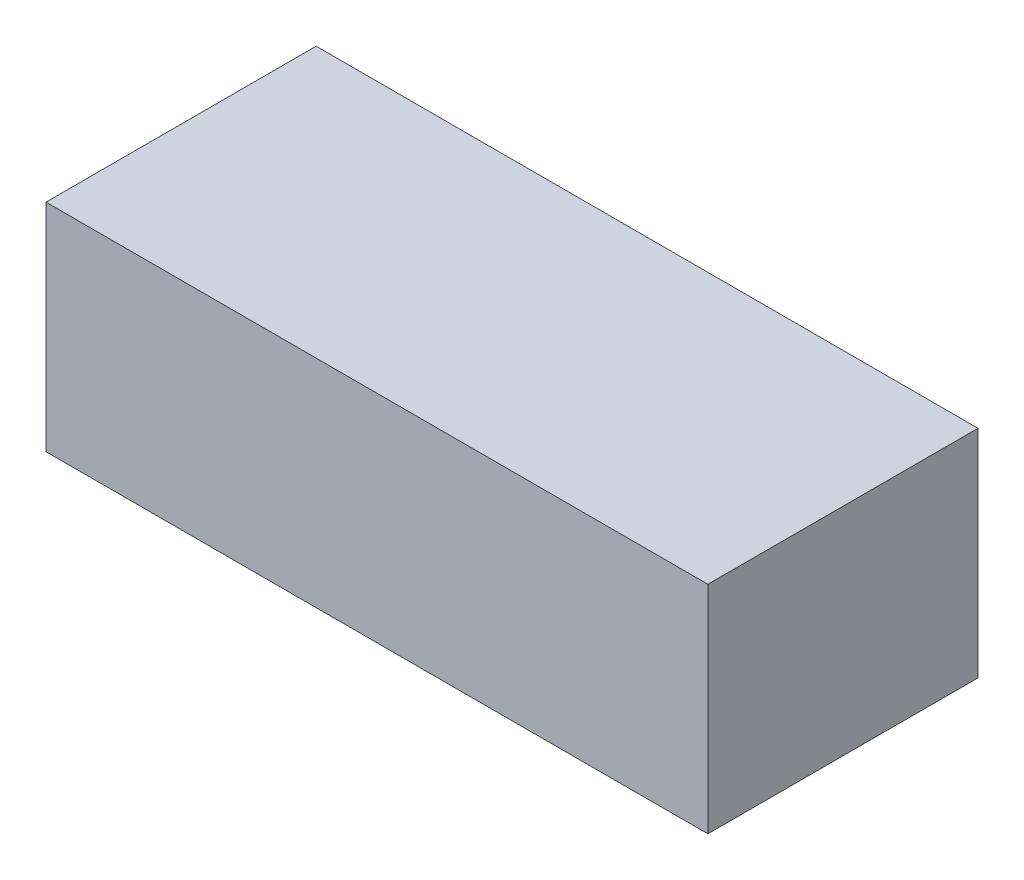
ISO-10303-21;
HEADER;
FILE_DESCRIPTION(('STEP AP214'),'2;1');
FILE_NAME('part.step','',(''),(''),'','','');
FILE_SCHEMA(('AUTOMOTIVE_DESIGN { 1 0 10303 214 1 1 1 1 }'));
ENDSEC;
DATA;
#1=APPLICATION_CONTEXT('core data for automotive mechanical design processes');
#2=APPLICATION_PROTOCOL_DEFINITION('international standard','automotive_design',2000,#1);
#3=PRODUCT_CONTEXT('',#1,'mechanical');
#4=PRODUCT('Part','Part','',(#3));
#5=PRODUCT_RELATED_PRODUCT_CATEGORY('part','',(#4));
#6=PRODUCT_DEFINITION_FORMATION('','',#4);
#7=PRODUCT_DEFINITION_CONTEXT('part definition',#1,'design');
#8=PRODUCT_DEFINITION('design','',#6,#7);
#9=PRODUCT_DEFINITION_SHAPE('','',#8);
#10=(LENGTH_UNIT() NAMED_UNIT(*) SI_UNIT(.MILLI.,.METRE.));
#11=(NAMED_UNIT(*) PLANE_ANGLE_UNIT() SI_UNIT($,.RADIAN.));
#12=(NAMED_UNIT(*) SI_UNIT($,.STERADIAN.) SOLID_ANGLE_UNIT());
#13=UNCERTAINTY_MEASURE_WITH_UNIT(LENGTH_MEASURE(1.E-05),#10,'distance_accuracy_value','');
#14=(GEOMETRIC_REPRESENTATION_CONTEXT(3) GLOBAL_UNCERTAINTY_ASSIGNED_CONTEXT((#13)) GLOBAL_UNIT_ASSIGNED_CONTEXT((#10,
#11,#12)) REPRESENTATION_CONTEXT('',''));
#15=CARTESIAN_POINT('',(0.,0.,0.));
#16=DIRECTION('',(0.,0.,1.));
#17=DIRECTION('',(1.,0.,0.));
#18=AXIS2_PLACEMENT_3D('',#15,#16,#17);
#19=CARTESIAN_POINT('',(-7.61501146984279,16.1266350487382,5.));
#20=DIRECTION('',(1.,0.,0.));
#21=DIRECTION('',(0.,1.,0.));
#22=AXIS2_PLACEMENT_3D('',#19,#20,#21);
#23=PLANE('',#22);
#24=DIRECTION('',(0.,-1.,0.));
#25=VECTOR('',#24,1.);
#26=CARTESIAN_POINT('',(-7.61501146984279,16.1266350487382,0.));
#27=LINE('',#26,#25);
#28=CARTESIAN_POINT('',(-7.61501146984279,16.1266350487382,0.));
#29=VERTEX_POINT('',#28);
#30=CARTESIAN_POINT('',(-7.61501146984279,12.1266350487382,0.));
#31=VERTEX_POINT('',#30);
#32=EDGE_CURVE('E95',#29,#31,#27,.T.);
#33=ORIENTED_EDGE('',*,*,#32,.T.);
#34=DIRECTION('',(0.,0.,-1.));
#35=VECTOR('',#34,1.);
#36=CARTESIAN_POINT('',(-7.61501146984279,12.1266350487382,5.));
#37=LINE('',#36,#35);
#38=CARTESIAN_POINT('',(-7.61501146984279,12.1266350487382,5.));
#39=VERTEX_POINT('',#38);
#40=EDGE_CURVE('E11',#39,#31,#37,.T.);
#41=ORIENTED_EDGE('',*,*,#40,.F.);
#42=DIRECTION('',(0.,-1.,0.));
#43=VECTOR('',#42,1.);
#44=CARTESIAN_POINT('',(-7.61501146984279,16.1266350487382,5.));
#45=LINE('',#44,#43);
#46=CARTESIAN_POINT('',(-7.61501146984279,16.1266350487382,5.));
#47=VERTEX_POINT('',#46);
#48=EDGE_CURVE('E83',#47,#39,#45,.T.);
#49=ORIENTED_EDGE('',*,*,#48,.F.);
#50=DIRECTION('',(0.,0.,-1.));
#51=VECTOR('',#50,1.);
#52=CARTESIAN_POINT('',(-7.61501146984279,16.1266350487382,5.));
#53=LINE('',#52,#51);
#54=EDGE_CURVE('E91',#47,#29,#53,.T.);
#55=ORIENTED_EDGE('',*,*,#54,.T.);
#56=EDGE_LOOP('',(#33,#41,#49,#55));
#57=FACE_BOUND('',#56,.T.);
#58=ADVANCED_FACE('F32',(#57),#23,.F.);
#59=CARTESIAN_POINT('',(-7.61501146984279,12.1266350487382,5.));
#60=DIRECTION('',(0.,1.,0.));
#61=DIRECTION('',(0.,0.,1.));
#62=AXIS2_PLACEMENT_3D('',#59,#60,#61);
#63=PLANE('',#62);
#64=DIRECTION('',(1.,0.,0.));
#65=VECTOR('',#64,1.);
#66=CARTESIAN_POINT('',(-7.61501146984279,12.1266350487382,0.));
#67=LINE('',#66,#65);
#68=CARTESIAN_POINT('',(4.63498853015721,12.1266350487382,0.));
#69=VERTEX_POINT('',#68);
#70=EDGE_CURVE('E87',#31,#69,#67,.T.);
#71=ORIENTED_EDGE('',*,*,#70,.T.);
#72=DIRECTION('',(0.,0.,-1.));
#73=VECTOR('',#72,1.);
#74=CARTESIAN_POINT('',(4.63498853015721,12.1266350487382,5.));
#75=LINE('',#74,#73);
#76=CARTESIAN_POINT('',(4.63498853015721,12.1266350487382,5.));
#77=VERTEX_POINT('',#76);
#78=EDGE_CURVE('E40',#77,#69,#75,.T.);
#79=ORIENTED_EDGE('',*,*,#78,.F.);
#80=DIRECTION('',(1.,0.,0.));
#81=VECTOR('',#80,1.);
#82=CARTESIAN_POINT('',(-7.61501146984279,12.1266350487382,5.));
#83=LINE('',#82,#81);
#84=EDGE_CURVE('E78',#39,#77,#83,.T.);
#85=ORIENTED_EDGE('',*,*,#84,.F.);
#86=ORIENTED_EDGE('',*,*,#40,.T.);
#87=EDGE_LOOP('',(#71,#79,#85,#86));
#88=FACE_BOUND('',#87,.T.);
#89=ADVANCED_FACE('F86',(#88),#63,.F.);
#90=CARTESIAN_POINT('',(4.63498853015721,16.1266350487382,5.));
#91=DIRECTION('',(-1.,0.,0.));
#92=DIRECTION('',(0.,0.,1.));
#93=AXIS2_PLACEMENT_3D('',#90,#91,#92);
#94=PLANE('',#93);
#95=DIRECTION('',(0.,1.,0.));
#96=VECTOR('',#95,1.);
#97=CARTESIAN_POINT('',(4.63498853015721,16.1266350487382,0.));
#98=LINE('',#97,#96);
#99=CARTESIAN_POINT('',(4.63498853015721,16.1266350487382,0.));
#100=VERTEX_POINT('',#99);
#101=EDGE_CURVE('E65',#69,#100,#98,.T.);
#102=ORIENTED_EDGE('',*,*,#101,.T.);
#103=DIRECTION('',(0.,0.,-1.));
#104=VECTOR('',#103,1.);
#105=CARTESIAN_POINT('',(4.63498853015721,16.1266350487382,5.));
#106=LINE('',#105,#104);
#107=CARTESIAN_POINT('',(4.63498853015721,16.1266350487382,5.));
#108=VERTEX_POINT('',#107);
#109=EDGE_CURVE('E88',#108,#100,#106,.T.);
#110=ORIENTED_EDGE('',*,*,#109,.F.);
#111=DIRECTION('',(0.,1.,0.));
#112=VECTOR('',#111,1.);
#113=CARTESIAN_POINT('',(4.63498853015721,16.1266350487382,5.));
#114=LINE('',#113,#112);
#115=EDGE_CURVE('E81',#77,#108,#114,.T.);
#116=ORIENTED_EDGE('',*,*,#115,.F.);
#117=ORIENTED_EDGE('',*,*,#78,.T.);
#118=EDGE_LOOP('',(#102,#110,#116,#117));
#119=FACE_BOUND('',#118,.T.);
#120=ADVANCED_FACE('F89',(#119),#94,.F.);
#121=CARTESIAN_POINT('',(-7.61501146984279,16.1266350487382,5.));
#122=DIRECTION('',(0.,-1.,0.));
#123=DIRECTION('',(0.,0.,-1.));
#124=AXIS2_PLACEMENT_3D('',#121,#122,#123);
#125=PLANE('',#124);
#126=DIRECTION('',(-1.,0.,0.));
#127=VECTOR('',#126,1.);
#128=CARTESIAN_POINT('',(-7.61501146984279,16.1266350487382,0.));
#129=LINE('',#128,#127);
#130=EDGE_CURVE('E71',#100,#29,#129,.T.);
#131=ORIENTED_EDGE('',*,*,#130,.T.);
#132=ORIENTED_EDGE('',*,*,#54,.F.);
#133=DIRECTION('',(-1.,0.,0.));
#134=VECTOR('',#133,1.);
#135=CARTESIAN_POINT('',(-7.61501146984279,16.1266350487382,5.));
#136=LINE('',#135,#134);
#137=EDGE_CURVE('E48',#108,#47,#136,.T.);
#138=ORIENTED_EDGE('',*,*,#137,.F.);
#139=ORIENTED_EDGE('',*,*,#109,.T.);
#140=EDGE_LOOP('',(#131,#132,#138,#139));
#141=FACE_BOUND('',#140,.T.);
#142=ADVANCED_FACE('F102',(#141),#125,.F.);
#143=CARTESIAN_POINT('',(0.,0.,5.));
#144=DIRECTION('',(0.,0.,1.));
#145=DIRECTION('',(1.,0.,0.));
#146=AXIS2_PLACEMENT_3D('',#143,#144,#145);
#147=PLANE('',#146);
#148=ORIENTED_EDGE('',*,*,#48,.T.);
#149=ORIENTED_EDGE('',*,*,#84,.T.);
#150=ORIENTED_EDGE('',*,*,#115,.T.);
#151=ORIENTED_EDGE('',*,*,#137,.T.);
#152=EDGE_LOOP('',(#148,#149,#150,#151));
#153=FACE_BOUND('',#152,.T.);
#154=ADVANCED_FACE('F79',(#153),#147,.T.);
#155=CARTESIAN_POINT('',(0.,0.,0.));
#156=DIRECTION('',(0.,0.,1.));
#157=DIRECTION('',(1.,0.,0.));
#158=AXIS2_PLACEMENT_3D('',#155,#156,#157);
#159=PLANE('',#158);
#160=ORIENTED_EDGE('',*,*,#32,.F.);
#161=ORIENTED_EDGE('',*,*,#130,.F.);
#162=ORIENTED_EDGE('',*,*,#101,.F.);
#163=ORIENTED_EDGE('',*,*,#70,.F.);
#164=EDGE_LOOP('',(#160,#161,#162,#163));
#165=FACE_BOUND('',#164,.T.);
#166=ADVANCED_FACE('F105',(#165),#159,.F.);
#167=CLOSED_SHELL('',(#58,#89,#120,#142,#154,#166));
#168=MANIFOLD_SOLID_BREP('B2',#167);
#169=ADVANCED_BREP_SHAPE_REPRESENTATION('',(#18,#168),#14);
#170=SHAPE_DEFINITION_REPRESENTATION(#9,#169);
ENDSEC;
END-ISO-10303-21;
